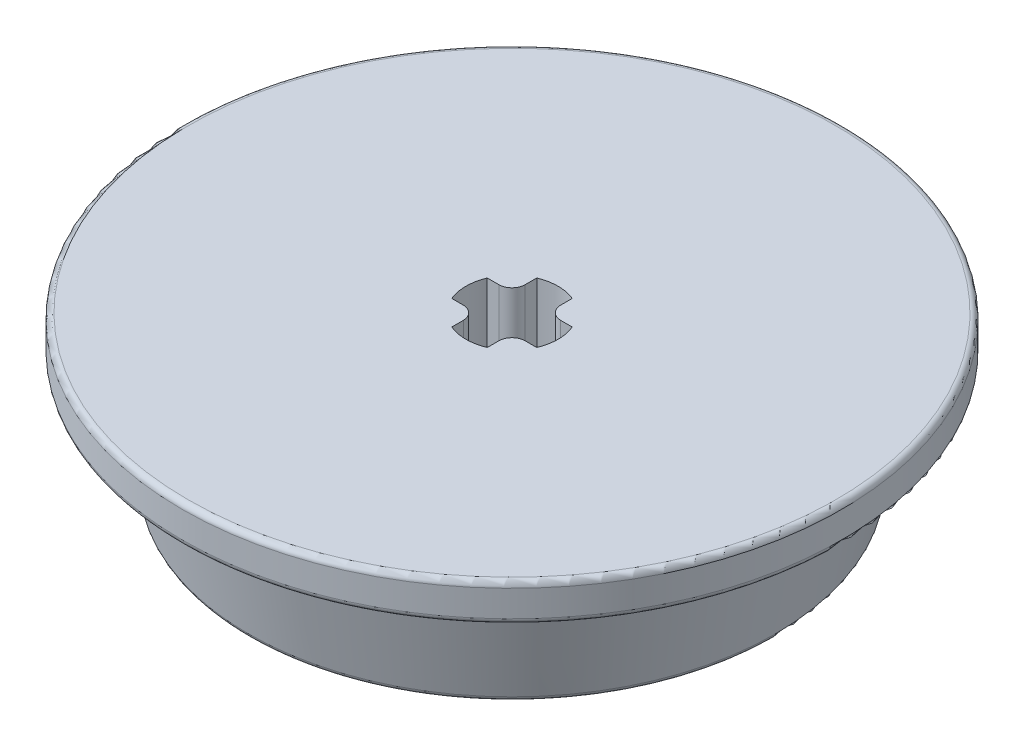
ISO-10303-21;
HEADER;
FILE_DESCRIPTION(('STEP AP214'),'2;1');
FILE_NAME('part.step','',(''),(''),'','','');
FILE_SCHEMA(('AUTOMOTIVE_DESIGN { 1 0 10303 214 1 1 1 1 }'));
ENDSEC;
DATA;
#1=APPLICATION_CONTEXT('core data for automotive mechanical design processes');
#2=APPLICATION_PROTOCOL_DEFINITION('international standard','automotive_design',2000,#1);
#3=PRODUCT_CONTEXT('',#1,'mechanical');
#4=PRODUCT('Part','Part','',(#3));
#5=PRODUCT_RELATED_PRODUCT_CATEGORY('part','',(#4));
#6=PRODUCT_DEFINITION_FORMATION('','',#4);
#7=PRODUCT_DEFINITION_CONTEXT('part definition',#1,'design');
#8=PRODUCT_DEFINITION('design','',#6,#7);
#9=PRODUCT_DEFINITION_SHAPE('','',#8);
#10=(LENGTH_UNIT() NAMED_UNIT(*) SI_UNIT(.MILLI.,.METRE.));
#11=(NAMED_UNIT(*) PLANE_ANGLE_UNIT() SI_UNIT($,.RADIAN.));
#12=(NAMED_UNIT(*) SI_UNIT($,.STERADIAN.) SOLID_ANGLE_UNIT());
#13=UNCERTAINTY_MEASURE_WITH_UNIT(LENGTH_MEASURE(1.E-05),#10,'distance_accuracy_value','');
#14=(GEOMETRIC_REPRESENTATION_CONTEXT(3) GLOBAL_UNCERTAINTY_ASSIGNED_CONTEXT((#13)) GLOBAL_UNIT_ASSIGNED_CONTEXT((#10,
#11,#12)) REPRESENTATION_CONTEXT('',''));
#15=CARTESIAN_POINT('',(0.,0.,0.));
#16=DIRECTION('',(0.,0.,1.));
#17=DIRECTION('',(1.,0.,0.));
#18=AXIS2_PLACEMENT_3D('',#15,#16,#17);
#19=CARTESIAN_POINT('',(0.,0.,0.));
#20=DIRECTION('',(0.,1.,0.));
#21=DIRECTION('',(0.,0.,1.));
#22=AXIS2_PLACEMENT_3D('',#19,#20,#21);
#23=PLANE('',#22);
#24=CARTESIAN_POINT('',(0.,0.,0.));
#25=DIRECTION('',(0.,1.,0.));
#26=DIRECTION('',(0.,0.,1.));
#27=AXIS2_PLACEMENT_3D('',#24,#25,#26);
#28=CIRCLE('',#27,17.1604709958205);
#29=CARTESIAN_POINT('',(0.,0.,17.1604709958205));
#30=VERTEX_POINT('',#29);
#31=EDGE_CURVE('E293',#30,#30,#28,.T.);
#32=ORIENTED_EDGE('',*,*,#31,.T.);
#33=EDGE_LOOP('',(#32));
#34=FACE_BOUND('',#33,.T.);
#35=DIRECTION('',(0.,0.,1.));
#36=VECTOR('',#35,1.);
#37=CARTESIAN_POINT('',(-0.940000000000001,0.,0.940000000000009));
#38=LINE('',#37,#36);
#39=CARTESIAN_POINT('',(-0.940000000000001,0.,1.64000000000001));
#40=VERTEX_POINT('',#39);
#41=CARTESIAN_POINT('',(-0.94,0.,2.25166604983954));
#42=VERTEX_POINT('',#41);
#43=EDGE_CURVE('E210',#40,#42,#38,.T.);
#44=ORIENTED_EDGE('',*,*,#43,.F.);
#45=CARTESIAN_POINT('',(-1.64,0.,1.64000000000001));
#46=DIRECTION('',(0.,1.,0.));
#47=DIRECTION('',(0.,0.,1.));
#48=AXIS2_PLACEMENT_3D('',#45,#46,#47);
#49=CIRCLE('',#48,0.7);
#50=CARTESIAN_POINT('',(-1.64,0.,0.940000000000009));
#51=VERTEX_POINT('',#50);
#52=EDGE_CURVE('E254',#40,#51,#49,.T.);
#53=ORIENTED_EDGE('',*,*,#52,.T.);
#54=DIRECTION('',(1.,0.,0.));
#55=VECTOR('',#54,1.);
#56=CARTESIAN_POINT('',(-2.25166604983954,0.,0.940000000000009));
#57=LINE('',#56,#55);
#58=CARTESIAN_POINT('',(-2.25166604983954,0.,0.940000000000008));
#59=VERTEX_POINT('',#58);
#60=EDGE_CURVE('E208',#59,#51,#57,.T.);
#61=ORIENTED_EDGE('',*,*,#60,.F.);
#62=CARTESIAN_POINT('',(0.,0.,0.));
#63=DIRECTION('',(0.,1.,0.));
#64=DIRECTION('',(0.,0.,1.));
#65=AXIS2_PLACEMENT_3D('',#62,#63,#64);
#66=CIRCLE('',#65,2.44);
#67=CARTESIAN_POINT('',(-2.25166604983954,0.,-0.940000000000009));
#68=VERTEX_POINT('',#67);
#69=EDGE_CURVE('E160',#68,#59,#66,.T.);
#70=ORIENTED_EDGE('',*,*,#69,.F.);
#71=DIRECTION('',(-1.,0.,0.));
#72=VECTOR('',#71,1.);
#73=CARTESIAN_POINT('',(-0.94,0.,-0.940000000000009));
#74=LINE('',#73,#72);
#75=CARTESIAN_POINT('',(-1.64,0.,-0.940000000000009));
#76=VERTEX_POINT('',#75);
#77=EDGE_CURVE('E205',#76,#68,#74,.T.);
#78=ORIENTED_EDGE('',*,*,#77,.F.);
#79=CARTESIAN_POINT('',(-1.64,0.,-1.64000000000001));
#80=DIRECTION('',(0.,1.,0.));
#81=DIRECTION('',(0.,0.,1.));
#82=AXIS2_PLACEMENT_3D('',#79,#80,#81);
#83=CIRCLE('',#82,0.7);
#84=CARTESIAN_POINT('',(-0.94,0.,-1.64000000000001));
#85=VERTEX_POINT('',#84);
#86=EDGE_CURVE('E248',#76,#85,#83,.T.);
#87=ORIENTED_EDGE('',*,*,#86,.T.);
#88=DIRECTION('',(0.,0.,1.));
#89=VECTOR('',#88,1.);
#90=CARTESIAN_POINT('',(-0.94,0.,-2.25166604983954));
#91=LINE('',#90,#89);
#92=CARTESIAN_POINT('',(-0.940000000000001,0.,-2.25166604983954));
#93=VERTEX_POINT('',#92);
#94=EDGE_CURVE('E202',#93,#85,#91,.T.);
#95=ORIENTED_EDGE('',*,*,#94,.F.);
#96=CARTESIAN_POINT('',(0.,0.,0.));
#97=DIRECTION('',(0.,1.,0.));
#98=DIRECTION('',(0.,0.,-1.));
#99=AXIS2_PLACEMENT_3D('',#96,#97,#98);
#100=CIRCLE('',#99,2.44);
#101=CARTESIAN_POINT('',(0.94,0.,-2.25166604983954));
#102=VERTEX_POINT('',#101);
#103=EDGE_CURVE('E227',#102,#93,#100,.T.);
#104=ORIENTED_EDGE('',*,*,#103,.F.);
#105=DIRECTION('',(0.,0.,-1.));
#106=VECTOR('',#105,1.);
#107=CARTESIAN_POINT('',(0.94,0.,-2.25166604983954));
#108=LINE('',#107,#106);
#109=CARTESIAN_POINT('',(0.94,0.,-1.64));
#110=VERTEX_POINT('',#109);
#111=EDGE_CURVE('E225',#110,#102,#108,.T.);
#112=ORIENTED_EDGE('',*,*,#111,.F.);
#113=CARTESIAN_POINT('',(1.64,0.,-1.64));
#114=DIRECTION('',(0.,1.,0.));
#115=DIRECTION('',(0.,0.,1.));
#116=AXIS2_PLACEMENT_3D('',#113,#114,#115);
#117=CIRCLE('',#116,0.7);
#118=CARTESIAN_POINT('',(1.64,0.,-0.940000000000003));
#119=VERTEX_POINT('',#118);
#120=EDGE_CURVE('E250',#110,#119,#117,.T.);
#121=ORIENTED_EDGE('',*,*,#120,.T.);
#122=DIRECTION('',(-1.,0.,0.));
#123=VECTOR('',#122,1.);
#124=CARTESIAN_POINT('',(0.94,0.,-0.940000000000003));
#125=LINE('',#124,#123);
#126=CARTESIAN_POINT('',(2.25166604983954,0.,-0.940000000000003));
#127=VERTEX_POINT('',#126);
#128=EDGE_CURVE('E223',#127,#119,#125,.T.);
#129=ORIENTED_EDGE('',*,*,#128,.F.);
#130=CARTESIAN_POINT('',(0.,0.,0.));
#131=DIRECTION('',(0.,1.,0.));
#132=DIRECTION('',(0.,0.,-1.));
#133=AXIS2_PLACEMENT_3D('',#130,#131,#132);
#134=CIRCLE('',#133,2.44);
#135=CARTESIAN_POINT('',(2.25166604983954,0.,0.940000000000003));
#136=VERTEX_POINT('',#135);
#137=EDGE_CURVE('E220',#136,#127,#134,.T.);
#138=ORIENTED_EDGE('',*,*,#137,.F.);
#139=DIRECTION('',(1.,0.,0.));
#140=VECTOR('',#139,1.);
#141=CARTESIAN_POINT('',(0.940000000000001,0.,0.940000000000003));
#142=LINE('',#141,#140);
#143=CARTESIAN_POINT('',(1.64,0.,0.940000000000003));
#144=VERTEX_POINT('',#143);
#145=EDGE_CURVE('E218',#144,#136,#142,.T.);
#146=ORIENTED_EDGE('',*,*,#145,.F.);
#147=CARTESIAN_POINT('',(1.64,0.,1.64));
#148=DIRECTION('',(0.,1.,0.));
#149=DIRECTION('',(0.,0.,1.));
#150=AXIS2_PLACEMENT_3D('',#147,#148,#149);
#151=CIRCLE('',#150,0.7);
#152=CARTESIAN_POINT('',(0.940000000000001,0.,1.64));
#153=VERTEX_POINT('',#152);
#154=EDGE_CURVE('E252',#144,#153,#151,.T.);
#155=ORIENTED_EDGE('',*,*,#154,.T.);
#156=DIRECTION('',(0.,0.,-1.));
#157=VECTOR('',#156,1.);
#158=CARTESIAN_POINT('',(0.940000000000001,0.,2.25166604983954));
#159=LINE('',#158,#157);
#160=CARTESIAN_POINT('',(0.94,0.,2.25166604983954));
#161=VERTEX_POINT('',#160);
#162=EDGE_CURVE('E215',#161,#153,#159,.T.);
#163=ORIENTED_EDGE('',*,*,#162,.F.);
#164=CARTESIAN_POINT('',(0.,0.,0.));
#165=DIRECTION('',(0.,1.,0.));
#166=DIRECTION('',(0.,0.,1.));
#167=AXIS2_PLACEMENT_3D('',#164,#165,#166);
#168=CIRCLE('',#167,2.44);
#169=EDGE_CURVE('E212',#42,#161,#168,.T.);
#170=ORIENTED_EDGE('',*,*,#169,.F.);
#171=EDGE_LOOP('',(#44,#53,#61,#70,#78,#87,#95,#104,#112,#121,#129,#138,#146,#155,#163,#170));
#172=FACE_BOUND('',#171,.T.);
#173=ADVANCED_FACE('F37',(#34,#172),#23,.T.);
#174=CARTESIAN_POINT('',(0.,0.,0.));
#175=DIRECTION('',(0.,-1.,0.));
#176=DIRECTION('',(0.,0.,-1.));
#177=AXIS2_PLACEMENT_3D('',#174,#175,#176);
#178=CYLINDRICAL_SURFACE('',#177,17.4604709958205);
#179=CARTESIAN_POINT('',(0.,-0.3,0.));
#180=DIRECTION('',(0.,1.,0.));
#181=DIRECTION('',(0.,0.,1.));
#182=AXIS2_PLACEMENT_3D('',#179,#180,#181);
#183=CIRCLE('',#182,17.4604709958205);
#184=CARTESIAN_POINT('',(0.,-0.3,17.4604709958205));
#185=VERTEX_POINT('',#184);
#186=EDGE_CURVE('E290',#185,#185,#183,.F.);
#187=ORIENTED_EDGE('',*,*,#186,.T.);
#188=EDGE_LOOP('',(#187));
#189=FACE_BOUND('',#188,.T.);
#190=CARTESIAN_POINT('',(0.,-1.7,0.));
#191=DIRECTION('',(0.,-1.,0.));
#192=DIRECTION('',(0.,0.,-1.));
#193=AXIS2_PLACEMENT_3D('',#190,#191,#192);
#194=CIRCLE('',#193,17.4604709958205);
#195=CARTESIAN_POINT('',(0.,-1.7,-17.4604709958205));
#196=VERTEX_POINT('',#195);
#197=EDGE_CURVE('E287',#196,#196,#194,.F.);
#198=ORIENTED_EDGE('',*,*,#197,.T.);
#199=EDGE_LOOP('',(#198));
#200=FACE_BOUND('',#199,.T.);
#201=ADVANCED_FACE('F310',(#189,#200),#178,.T.);
#202=CARTESIAN_POINT('',(17.4604709958205,-2.,0.));
#203=DIRECTION('',(0.,-1.,0.));
#204=DIRECTION('',(0.,0.,-1.));
#205=AXIS2_PLACEMENT_3D('',#202,#203,#204);
#206=PLANE('',#205);
#207=CARTESIAN_POINT('',(0.,-2.,0.));
#208=DIRECTION('',(0.,-1.,0.));
#209=DIRECTION('',(0.,0.,-1.));
#210=AXIS2_PLACEMENT_3D('',#207,#208,#209);
#211=CIRCLE('',#210,15.2506361989496);
#212=CARTESIAN_POINT('',(0.,-2.,-15.2506361989496));
#213=VERTEX_POINT('',#212);
#214=EDGE_CURVE('E11',#213,#213,#211,.F.);
#215=ORIENTED_EDGE('',*,*,#214,.T.);
#216=EDGE_LOOP('',(#215));
#217=FACE_BOUND('',#216,.T.);
#218=CARTESIAN_POINT('',(0.,-2.,0.));
#219=DIRECTION('',(0.,-1.,0.));
#220=DIRECTION('',(0.,0.,-1.));
#221=AXIS2_PLACEMENT_3D('',#218,#219,#220);
#222=CIRCLE('',#221,17.1604709958205);
#223=CARTESIAN_POINT('',(0.,-2.,-17.1604709958205));
#224=VERTEX_POINT('',#223);
#225=EDGE_CURVE('E45',#224,#224,#222,.T.);
#226=ORIENTED_EDGE('',*,*,#225,.T.);
#227=EDGE_LOOP('',(#226));
#228=FACE_BOUND('',#227,.T.);
#229=ADVANCED_FACE('F298',(#217,#228),#206,.T.);
#230=CARTESIAN_POINT('',(0.,-8.,0.));
#231=DIRECTION('',(0.,1.,0.));
#232=DIRECTION('',(0.,0.,1.));
#233=AXIS2_PLACEMENT_3D('',#230,#231,#232);
#234=CONICAL_SURFACE('',#233,13.9155,0.178819305732636);
#235=CARTESIAN_POINT('',(0.,-7.75336034909016,0.));
#236=DIRECTION('',(0.,-1.,0.));
#237=DIRECTION('',(0.,0.,-1.));
#238=AXIS2_PLACEMENT_3D('',#235,#236,#237);
#239=CIRCLE('',#238,13.960080116902);
#240=CARTESIAN_POINT('',(0.,-7.75336034909016,-13.960080116902));
#241=VERTEX_POINT('',#240);
#242=EDGE_CURVE('E284',#241,#241,#239,.F.);
#243=ORIENTED_EDGE('',*,*,#242,.T.);
#244=EDGE_LOOP('',(#243));
#245=FACE_BOUND('',#244,.T.);
#246=CARTESIAN_POINT('',(0.,-2.24663965090983,0.));
#247=DIRECTION('',(0.,1.,0.));
#248=DIRECTION('',(0.,0.,1.));
#249=AXIS2_PLACEMENT_3D('',#246,#247,#248);
#250=CIRCLE('',#249,14.955419883098);
#251=CARTESIAN_POINT('',(0.,-2.24663965090983,14.955419883098));
#252=VERTEX_POINT('',#251);
#253=EDGE_CURVE('E281',#252,#252,#250,.F.);
#254=ORIENTED_EDGE('',*,*,#253,.T.);
#255=EDGE_LOOP('',(#254));
#256=FACE_BOUND('',#255,.T.);
#257=ADVANCED_FACE('F520',(#245,#256),#234,.T.);
#258=CARTESIAN_POINT('',(13.9155,-8.,0.));
#259=DIRECTION('',(0.,-1.,0.));
#260=DIRECTION('',(0.,0.,-1.));
#261=AXIS2_PLACEMENT_3D('',#258,#259,#260);
#262=PLANE('',#261);
#263=CARTESIAN_POINT('',(0.,-8.,0.));
#264=DIRECTION('',(0.,-1.,0.));
#265=DIRECTION('',(0.,0.,-1.));
#266=AXIS2_PLACEMENT_3D('',#263,#264,#265);
#267=CIRCLE('',#266,13.6648638010504);
#268=CARTESIAN_POINT('',(0.,-8.,-13.6648638010504));
#269=VERTEX_POINT('',#268);
#270=EDGE_CURVE('E278',#269,#269,#267,.T.);
#271=ORIENTED_EDGE('',*,*,#270,.T.);
#272=EDGE_LOOP('',(#271));
#273=FACE_BOUND('',#272,.T.);
#274=DIRECTION('',(1.,0.,0.));
#275=VECTOR('',#274,1.);
#276=CARTESIAN_POINT('',(-2.25166604983954,-8.,0.940000000000009));
#277=LINE('',#276,#275);
#278=CARTESIAN_POINT('',(-2.25166604983954,-8.,0.940000000000008));
#279=VERTEX_POINT('',#278);
#280=CARTESIAN_POINT('',(-1.64,-8.,0.940000000000009));
#281=VERTEX_POINT('',#280);
#282=EDGE_CURVE('E168',#279,#281,#277,.T.);
#283=ORIENTED_EDGE('',*,*,#282,.T.);
#284=CARTESIAN_POINT('',(-1.64,-8.,1.64000000000001));
#285=DIRECTION('',(0.,-1.,0.));
#286=DIRECTION('',(0.,0.,-1.));
#287=AXIS2_PLACEMENT_3D('',#284,#285,#286);
#288=CIRCLE('',#287,0.7);
#289=CARTESIAN_POINT('',(-0.940000000000001,-8.,1.64000000000001));
#290=VERTEX_POINT('',#289);
#291=EDGE_CURVE('E262',#281,#290,#288,.T.);
#292=ORIENTED_EDGE('',*,*,#291,.T.);
#293=DIRECTION('',(0.,0.,1.));
#294=VECTOR('',#293,1.);
#295=CARTESIAN_POINT('',(-0.940000000000001,-8.,0.940000000000009));
#296=LINE('',#295,#294);
#297=CARTESIAN_POINT('',(-0.94,-8.,2.25166604983954));
#298=VERTEX_POINT('',#297);
#299=EDGE_CURVE('E173',#290,#298,#296,.T.);
#300=ORIENTED_EDGE('',*,*,#299,.T.);
#301=CARTESIAN_POINT('',(0.,-8.,0.));
#302=DIRECTION('',(0.,1.,0.));
#303=DIRECTION('',(0.,0.,1.));
#304=AXIS2_PLACEMENT_3D('',#301,#302,#303);
#305=CIRCLE('',#304,2.44);
#306=CARTESIAN_POINT('',(0.94,-8.,2.25166604983954));
#307=VERTEX_POINT('',#306);
#308=EDGE_CURVE('E184',#298,#307,#305,.T.);
#309=ORIENTED_EDGE('',*,*,#308,.T.);
#310=DIRECTION('',(0.,0.,-1.));
#311=VECTOR('',#310,1.);
#312=CARTESIAN_POINT('',(0.940000000000001,-8.,2.25166604983954));
#313=LINE('',#312,#311);
#314=CARTESIAN_POINT('',(0.940000000000001,-8.,1.64));
#315=VERTEX_POINT('',#314);
#316=EDGE_CURVE('E187',#307,#315,#313,.T.);
#317=ORIENTED_EDGE('',*,*,#316,.T.);
#318=CARTESIAN_POINT('',(1.64,-8.,1.64));
#319=DIRECTION('',(0.,-1.,0.));
#320=DIRECTION('',(0.,0.,-1.));
#321=AXIS2_PLACEMENT_3D('',#318,#319,#320);
#322=CIRCLE('',#321,0.7);
#323=CARTESIAN_POINT('',(1.64,-8.,0.940000000000003));
#324=VERTEX_POINT('',#323);
#325=EDGE_CURVE('E260',#315,#324,#322,.T.);
#326=ORIENTED_EDGE('',*,*,#325,.T.);
#327=DIRECTION('',(1.,0.,0.));
#328=VECTOR('',#327,1.);
#329=CARTESIAN_POINT('',(0.940000000000001,-8.,0.940000000000003));
#330=LINE('',#329,#328);
#331=CARTESIAN_POINT('',(2.25166604983954,-8.,0.940000000000003));
#332=VERTEX_POINT('',#331);
#333=EDGE_CURVE('E190',#324,#332,#330,.T.);
#334=ORIENTED_EDGE('',*,*,#333,.T.);
#335=CARTESIAN_POINT('',(0.,-8.,0.));
#336=DIRECTION('',(0.,1.,0.));
#337=DIRECTION('',(0.,0.,-1.));
#338=AXIS2_PLACEMENT_3D('',#335,#336,#337);
#339=CIRCLE('',#338,2.44);
#340=CARTESIAN_POINT('',(2.25166604983954,-8.,-0.940000000000003));
#341=VERTEX_POINT('',#340);
#342=EDGE_CURVE('E192',#332,#341,#339,.T.);
#343=ORIENTED_EDGE('',*,*,#342,.T.);
#344=DIRECTION('',(-1.,0.,0.));
#345=VECTOR('',#344,1.);
#346=CARTESIAN_POINT('',(0.94,-8.,-0.940000000000003));
#347=LINE('',#346,#345);
#348=CARTESIAN_POINT('',(1.64,-8.,-0.940000000000003));
#349=VERTEX_POINT('',#348);
#350=EDGE_CURVE('E195',#341,#349,#347,.T.);
#351=ORIENTED_EDGE('',*,*,#350,.T.);
#352=CARTESIAN_POINT('',(1.64,-8.,-1.64));
#353=DIRECTION('',(0.,-1.,0.));
#354=DIRECTION('',(0.,0.,-1.));
#355=AXIS2_PLACEMENT_3D('',#352,#353,#354);
#356=CIRCLE('',#355,0.7);
#357=CARTESIAN_POINT('',(0.94,-8.,-1.64));
#358=VERTEX_POINT('',#357);
#359=EDGE_CURVE('E52',#349,#358,#356,.T.);
#360=ORIENTED_EDGE('',*,*,#359,.T.);
#361=DIRECTION('',(0.,0.,-1.));
#362=VECTOR('',#361,1.);
#363=CARTESIAN_POINT('',(0.94,-8.,-2.25166604983954));
#364=LINE('',#363,#362);
#365=CARTESIAN_POINT('',(0.94,-8.,-2.25166604983954));
#366=VERTEX_POINT('',#365);
#367=EDGE_CURVE('E197',#358,#366,#364,.T.);
#368=ORIENTED_EDGE('',*,*,#367,.T.);
#369=CARTESIAN_POINT('',(0.,-8.,0.));
#370=DIRECTION('',(0.,1.,0.));
#371=DIRECTION('',(0.,0.,-1.));
#372=AXIS2_PLACEMENT_3D('',#369,#370,#371);
#373=CIRCLE('',#372,2.44);
#374=CARTESIAN_POINT('',(-0.940000000000001,-8.,-2.25166604983954));
#375=VERTEX_POINT('',#374);
#376=EDGE_CURVE('E199',#366,#375,#373,.T.);
#377=ORIENTED_EDGE('',*,*,#376,.T.);
#378=DIRECTION('',(0.,0.,1.));
#379=VECTOR('',#378,1.);
#380=CARTESIAN_POINT('',(-0.94,-8.,-2.25166604983954));
#381=LINE('',#380,#379);
#382=CARTESIAN_POINT('',(-0.94,-8.,-1.64000000000001));
#383=VERTEX_POINT('',#382);
#384=EDGE_CURVE('E179',#375,#383,#381,.T.);
#385=ORIENTED_EDGE('',*,*,#384,.T.);
#386=CARTESIAN_POINT('',(-1.64,-8.,-1.64000000000001));
#387=DIRECTION('',(0.,-1.,0.));
#388=DIRECTION('',(0.,0.,-1.));
#389=AXIS2_PLACEMENT_3D('',#386,#387,#388);
#390=CIRCLE('',#389,0.7);
#391=CARTESIAN_POINT('',(-1.64,-8.,-0.940000000000009));
#392=VERTEX_POINT('',#391);
#393=EDGE_CURVE('E257',#383,#392,#390,.T.);
#394=ORIENTED_EDGE('',*,*,#393,.T.);
#395=DIRECTION('',(-1.,0.,0.));
#396=VECTOR('',#395,1.);
#397=CARTESIAN_POINT('',(-0.94,-8.,-0.940000000000009));
#398=LINE('',#397,#396);
#399=CARTESIAN_POINT('',(-2.25166604983954,-8.,-0.940000000000009));
#400=VERTEX_POINT('',#399);
#401=EDGE_CURVE('E177',#392,#400,#398,.T.);
#402=ORIENTED_EDGE('',*,*,#401,.T.);
#403=CARTESIAN_POINT('',(0.,-8.,0.));
#404=DIRECTION('',(0.,1.,0.));
#405=DIRECTION('',(0.,0.,1.));
#406=AXIS2_PLACEMENT_3D('',#403,#404,#405);
#407=CIRCLE('',#406,2.44);
#408=EDGE_CURVE('E157',#400,#279,#407,.T.);
#409=ORIENTED_EDGE('',*,*,#408,.T.);
#410=EDGE_LOOP('',(#283,#292,#300,#309,#317,#326,#334,#343,#351,#360,#368,#377,#385,#394,#402,#409));
#411=FACE_BOUND('',#410,.T.);
#412=ADVANCED_FACE('F175',(#273,#411),#262,.T.);
#413=CARTESIAN_POINT('',(-0.94,-8.,-2.25166604983954));
#414=DIRECTION('',(-1.,0.,0.));
#415=DIRECTION('',(0.,0.,1.));
#416=AXIS2_PLACEMENT_3D('',#413,#414,#415);
#417=PLANE('',#416);
#418=ORIENTED_EDGE('',*,*,#94,.T.);
#419=DIRECTION('',(0.,1.,0.));
#420=VECTOR('',#419,1.);
#421=CARTESIAN_POINT('',(-0.94,-8.,-1.64000000000001));
#422=LINE('',#421,#420);
#423=EDGE_CURVE('E276',#85,#383,#422,.F.);
#424=ORIENTED_EDGE('',*,*,#423,.T.);
#425=ORIENTED_EDGE('',*,*,#384,.F.);
#426=DIRECTION('',(0.,1.,0.));
#427=VECTOR('',#426,1.);
#428=CARTESIAN_POINT('',(-0.940000000000001,-8.,-2.25166604983954));
#429=LINE('',#428,#427);
#430=EDGE_CURVE('E230',#375,#93,#429,.T.);
#431=ORIENTED_EDGE('',*,*,#430,.T.);
#432=EDGE_LOOP('',(#418,#424,#425,#431));
#433=FACE_BOUND('',#432,.T.);
#434=ADVANCED_FACE('F501',(#433),#417,.F.);
#435=CARTESIAN_POINT('',(0.,-8.,0.));
#436=DIRECTION('',(0.,1.,0.));
#437=DIRECTION('',(0.,0.,1.));
#438=AXIS2_PLACEMENT_3D('',#435,#436,#437);
#439=CYLINDRICAL_SURFACE('',#438,2.44);
#440=ORIENTED_EDGE('',*,*,#103,.T.);
#441=ORIENTED_EDGE('',*,*,#430,.F.);
#442=ORIENTED_EDGE('',*,*,#376,.F.);
#443=DIRECTION('',(0.,1.,0.));
#444=VECTOR('',#443,1.);
#445=CARTESIAN_POINT('',(0.94,-8.,-2.25166604983954));
#446=LINE('',#445,#444);
#447=EDGE_CURVE('E233',#366,#102,#446,.T.);
#448=ORIENTED_EDGE('',*,*,#447,.T.);
#449=EDGE_LOOP('',(#440,#441,#442,#448));
#450=FACE_BOUND('',#449,.T.);
#451=ADVANCED_FACE('F491',(#450),#439,.F.);
#452=CARTESIAN_POINT('',(0.94,-8.,-2.25166604983954));
#453=DIRECTION('',(1.,0.,0.));
#454=DIRECTION('',(0.,0.,-1.));
#455=AXIS2_PLACEMENT_3D('',#452,#453,#454);
#456=PLANE('',#455);
#457=ORIENTED_EDGE('',*,*,#367,.F.);
#458=DIRECTION('',(0.,1.,0.));
#459=VECTOR('',#458,1.);
#460=CARTESIAN_POINT('',(0.94,-8.,-1.64));
#461=LINE('',#460,#459);
#462=EDGE_CURVE('E269',#358,#110,#461,.T.);
#463=ORIENTED_EDGE('',*,*,#462,.T.);
#464=ORIENTED_EDGE('',*,*,#111,.T.);
#465=ORIENTED_EDGE('',*,*,#447,.F.);
#466=EDGE_LOOP('',(#457,#463,#464,#465));
#467=FACE_BOUND('',#466,.T.);
#468=ADVANCED_FACE('F482',(#467),#456,.F.);
#469=CARTESIAN_POINT('',(0.94,-8.,-0.940000000000003));
#470=DIRECTION('',(0.,0.,-1.));
#471=DIRECTION('',(-1.,0.,0.));
#472=AXIS2_PLACEMENT_3D('',#469,#470,#471);
#473=PLANE('',#472);
#474=ORIENTED_EDGE('',*,*,#128,.T.);
#475=DIRECTION('',(0.,1.,0.));
#476=VECTOR('',#475,1.);
#477=CARTESIAN_POINT('',(1.64,-8.,-0.940000000000003));
#478=LINE('',#477,#476);
#479=EDGE_CURVE('E60',#119,#349,#478,.F.);
#480=ORIENTED_EDGE('',*,*,#479,.T.);
#481=ORIENTED_EDGE('',*,*,#350,.F.);
#482=DIRECTION('',(0.,1.,0.));
#483=VECTOR('',#482,1.);
#484=CARTESIAN_POINT('',(2.25166604983954,-8.,-0.940000000000003));
#485=LINE('',#484,#483);
#486=EDGE_CURVE('E236',#341,#127,#485,.T.);
#487=ORIENTED_EDGE('',*,*,#486,.T.);
#488=EDGE_LOOP('',(#474,#480,#481,#487));
#489=FACE_BOUND('',#488,.T.);
#490=ADVANCED_FACE('F472',(#489),#473,.F.);
#491=CARTESIAN_POINT('',(0.,-8.,0.));
#492=DIRECTION('',(0.,1.,0.));
#493=DIRECTION('',(0.,0.,1.));
#494=AXIS2_PLACEMENT_3D('',#491,#492,#493);
#495=CYLINDRICAL_SURFACE('',#494,2.44);
#496=ORIENTED_EDGE('',*,*,#137,.T.);
#497=ORIENTED_EDGE('',*,*,#486,.F.);
#498=ORIENTED_EDGE('',*,*,#342,.F.);
#499=DIRECTION('',(0.,1.,0.));
#500=VECTOR('',#499,1.);
#501=CARTESIAN_POINT('',(2.25166604983954,-8.,0.940000000000003));
#502=LINE('',#501,#500);
#503=EDGE_CURVE('E238',#332,#136,#502,.T.);
#504=ORIENTED_EDGE('',*,*,#503,.T.);
#505=EDGE_LOOP('',(#496,#497,#498,#504));
#506=FACE_BOUND('',#505,.T.);
#507=ADVANCED_FACE('F462',(#506),#495,.F.);
#508=CARTESIAN_POINT('',(0.940000000000001,-8.,0.940000000000003));
#509=DIRECTION('',(0.,0.,1.));
#510=DIRECTION('',(1.,0.,0.));
#511=AXIS2_PLACEMENT_3D('',#508,#509,#510);
#512=PLANE('',#511);
#513=ORIENTED_EDGE('',*,*,#333,.F.);
#514=DIRECTION('',(0.,1.,0.));
#515=VECTOR('',#514,1.);
#516=CARTESIAN_POINT('',(1.64,-8.,0.940000000000003));
#517=LINE('',#516,#515);
#518=EDGE_CURVE('E264',#324,#144,#517,.T.);
#519=ORIENTED_EDGE('',*,*,#518,.T.);
#520=ORIENTED_EDGE('',*,*,#145,.T.);
#521=ORIENTED_EDGE('',*,*,#503,.F.);
#522=EDGE_LOOP('',(#513,#519,#520,#521));
#523=FACE_BOUND('',#522,.T.);
#524=ADVANCED_FACE('F452',(#523),#512,.F.);
#525=CARTESIAN_POINT('',(0.940000000000001,-8.,2.25166604983954));
#526=DIRECTION('',(1.,0.,0.));
#527=DIRECTION('',(0.,0.,-1.));
#528=AXIS2_PLACEMENT_3D('',#525,#526,#527);
#529=PLANE('',#528);
#530=ORIENTED_EDGE('',*,*,#162,.T.);
#531=DIRECTION('',(0.,1.,0.));
#532=VECTOR('',#531,1.);
#533=CARTESIAN_POINT('',(0.940000000000001,-8.,1.64));
#534=LINE('',#533,#532);
#535=EDGE_CURVE('E267',#153,#315,#534,.F.);
#536=ORIENTED_EDGE('',*,*,#535,.T.);
#537=ORIENTED_EDGE('',*,*,#316,.F.);
#538=DIRECTION('',(0.,1.,0.));
#539=VECTOR('',#538,1.);
#540=CARTESIAN_POINT('',(0.94,-8.,2.25166604983954));
#541=LINE('',#540,#539);
#542=EDGE_CURVE('E241',#307,#161,#541,.T.);
#543=ORIENTED_EDGE('',*,*,#542,.T.);
#544=EDGE_LOOP('',(#530,#536,#537,#543));
#545=FACE_BOUND('',#544,.T.);
#546=ADVANCED_FACE('F442',(#545),#529,.F.);
#547=CARTESIAN_POINT('',(0.,-8.,0.));
#548=DIRECTION('',(0.,1.,0.));
#549=DIRECTION('',(0.,0.,1.));
#550=AXIS2_PLACEMENT_3D('',#547,#548,#549);
#551=CYLINDRICAL_SURFACE('',#550,2.44);
#552=ORIENTED_EDGE('',*,*,#169,.T.);
#553=ORIENTED_EDGE('',*,*,#542,.F.);
#554=ORIENTED_EDGE('',*,*,#308,.F.);
#555=DIRECTION('',(0.,1.,0.));
#556=VECTOR('',#555,1.);
#557=CARTESIAN_POINT('',(-0.94,-8.,2.25166604983954));
#558=LINE('',#557,#556);
#559=EDGE_CURVE('E164',#298,#42,#558,.T.);
#560=ORIENTED_EDGE('',*,*,#559,.T.);
#561=EDGE_LOOP('',(#552,#553,#554,#560));
#562=FACE_BOUND('',#561,.T.);
#563=ADVANCED_FACE('F432',(#562),#551,.F.);
#564=CARTESIAN_POINT('',(-0.940000000000001,-8.,0.940000000000009));
#565=DIRECTION('',(-1.,0.,0.));
#566=DIRECTION('',(0.,0.,1.));
#567=AXIS2_PLACEMENT_3D('',#564,#565,#566);
#568=PLANE('',#567);
#569=ORIENTED_EDGE('',*,*,#299,.F.);
#570=DIRECTION('',(0.,1.,0.));
#571=VECTOR('',#570,1.);
#572=CARTESIAN_POINT('',(-0.940000000000001,-8.,1.64000000000001));
#573=LINE('',#572,#571);
#574=EDGE_CURVE('E232',#290,#40,#573,.T.);
#575=ORIENTED_EDGE('',*,*,#574,.T.);
#576=ORIENTED_EDGE('',*,*,#43,.T.);
#577=ORIENTED_EDGE('',*,*,#559,.F.);
#578=EDGE_LOOP('',(#569,#575,#576,#577));
#579=FACE_BOUND('',#578,.T.);
#580=ADVANCED_FACE('F423',(#579),#568,.F.);
#581=CARTESIAN_POINT('',(-2.25166604983954,-8.,0.940000000000009));
#582=DIRECTION('',(0.,0.,1.));
#583=DIRECTION('',(1.,0.,0.));
#584=AXIS2_PLACEMENT_3D('',#581,#582,#583);
#585=PLANE('',#584);
#586=ORIENTED_EDGE('',*,*,#60,.T.);
#587=DIRECTION('',(0.,1.,0.));
#588=VECTOR('',#587,1.);
#589=CARTESIAN_POINT('',(-1.64,-8.,0.940000000000009));
#590=LINE('',#589,#588);
#591=EDGE_CURVE('E171',#51,#281,#590,.F.);
#592=ORIENTED_EDGE('',*,*,#591,.T.);
#593=ORIENTED_EDGE('',*,*,#282,.F.);
#594=DIRECTION('',(0.,1.,0.));
#595=VECTOR('',#594,1.);
#596=CARTESIAN_POINT('',(-2.25166604983954,-8.,0.940000000000008));
#597=LINE('',#596,#595);
#598=EDGE_CURVE('E152',#279,#59,#597,.T.);
#599=ORIENTED_EDGE('',*,*,#598,.T.);
#600=EDGE_LOOP('',(#586,#592,#593,#599));
#601=FACE_BOUND('',#600,.T.);
#602=ADVANCED_FACE('F169',(#601),#585,.F.);
#603=CARTESIAN_POINT('',(0.,-8.,0.));
#604=DIRECTION('',(0.,1.,0.));
#605=DIRECTION('',(0.,0.,1.));
#606=AXIS2_PLACEMENT_3D('',#603,#604,#605);
#607=CYLINDRICAL_SURFACE('',#606,2.44);
#608=ORIENTED_EDGE('',*,*,#69,.T.);
#609=ORIENTED_EDGE('',*,*,#598,.F.);
#610=ORIENTED_EDGE('',*,*,#408,.F.);
#611=DIRECTION('',(0.,1.,0.));
#612=VECTOR('',#611,1.);
#613=CARTESIAN_POINT('',(-2.25166604983954,-8.,-0.940000000000009));
#614=LINE('',#613,#612);
#615=EDGE_CURVE('E165',#400,#68,#614,.T.);
#616=ORIENTED_EDGE('',*,*,#615,.T.);
#617=EDGE_LOOP('',(#608,#609,#610,#616));
#618=FACE_BOUND('',#617,.T.);
#619=ADVANCED_FACE('F154',(#618),#607,.F.);
#620=CARTESIAN_POINT('',(-0.94,-8.,-0.940000000000009));
#621=DIRECTION('',(0.,0.,-1.));
#622=DIRECTION('',(-1.,0.,0.));
#623=AXIS2_PLACEMENT_3D('',#620,#621,#622);
#624=PLANE('',#623);
#625=ORIENTED_EDGE('',*,*,#401,.F.);
#626=DIRECTION('',(0.,1.,0.));
#627=VECTOR('',#626,1.);
#628=CARTESIAN_POINT('',(-1.64,-8.,-0.940000000000009));
#629=LINE('',#628,#627);
#630=EDGE_CURVE('E273',#392,#76,#629,.T.);
#631=ORIENTED_EDGE('',*,*,#630,.T.);
#632=ORIENTED_EDGE('',*,*,#77,.T.);
#633=ORIENTED_EDGE('',*,*,#615,.F.);
#634=EDGE_LOOP('',(#625,#631,#632,#633));
#635=FACE_BOUND('',#634,.T.);
#636=ADVANCED_FACE('F325',(#635),#624,.F.);
#637=CARTESIAN_POINT('',(-1.64,-8.,1.64000000000001));
#638=DIRECTION('',(0.,1.,0.));
#639=DIRECTION('',(0.,0.,1.));
#640=AXIS2_PLACEMENT_3D('',#637,#638,#639);
#641=CYLINDRICAL_SURFACE('',#640,0.7);
#642=ORIENTED_EDGE('',*,*,#291,.F.);
#643=ORIENTED_EDGE('',*,*,#591,.F.);
#644=ORIENTED_EDGE('',*,*,#52,.F.);
#645=ORIENTED_EDGE('',*,*,#574,.F.);
#646=EDGE_LOOP('',(#642,#643,#644,#645));
#647=FACE_BOUND('',#646,.T.);
#648=ADVANCED_FACE('F321',(#647),#641,.T.);
#649=CARTESIAN_POINT('',(1.64,-8.,1.64));
#650=DIRECTION('',(0.,1.,0.));
#651=DIRECTION('',(0.,0.,1.));
#652=AXIS2_PLACEMENT_3D('',#649,#650,#651);
#653=CYLINDRICAL_SURFACE('',#652,0.7);
#654=ORIENTED_EDGE('',*,*,#325,.F.);
#655=ORIENTED_EDGE('',*,*,#535,.F.);
#656=ORIENTED_EDGE('',*,*,#154,.F.);
#657=ORIENTED_EDGE('',*,*,#518,.F.);
#658=EDGE_LOOP('',(#654,#655,#656,#657));
#659=FACE_BOUND('',#658,.T.);
#660=ADVANCED_FACE('F324',(#659),#653,.T.);
#661=CARTESIAN_POINT('',(1.64,-8.,-1.64));
#662=DIRECTION('',(0.,1.,0.));
#663=DIRECTION('',(0.,0.,1.));
#664=AXIS2_PLACEMENT_3D('',#661,#662,#663);
#665=CYLINDRICAL_SURFACE('',#664,0.7);
#666=ORIENTED_EDGE('',*,*,#359,.F.);
#667=ORIENTED_EDGE('',*,*,#479,.F.);
#668=ORIENTED_EDGE('',*,*,#120,.F.);
#669=ORIENTED_EDGE('',*,*,#462,.F.);
#670=EDGE_LOOP('',(#666,#667,#668,#669));
#671=FACE_BOUND('',#670,.T.);
#672=ADVANCED_FACE('F329',(#671),#665,.T.);
#673=CARTESIAN_POINT('',(-1.64,-8.,-1.64000000000001));
#674=DIRECTION('',(0.,1.,0.));
#675=DIRECTION('',(0.,0.,1.));
#676=AXIS2_PLACEMENT_3D('',#673,#674,#675);
#677=CYLINDRICAL_SURFACE('',#676,0.7);
#678=ORIENTED_EDGE('',*,*,#393,.F.);
#679=ORIENTED_EDGE('',*,*,#423,.F.);
#680=ORIENTED_EDGE('',*,*,#86,.F.);
#681=ORIENTED_EDGE('',*,*,#630,.F.);
#682=EDGE_LOOP('',(#678,#679,#680,#681));
#683=FACE_BOUND('',#682,.T.);
#684=ADVANCED_FACE('F333',(#683),#677,.T.);
#685=CARTESIAN_POINT('',(0.,-7.7,0.));
#686=DIRECTION('',(0.,-1.,0.));
#687=DIRECTION('',(0.,0.,-1.));
#688=AXIS2_PLACEMENT_3D('',#685,#686,#687);
#689=TOROIDAL_SURFACE('',#688,13.6648638010504,0.3);
#690=ORIENTED_EDGE('',*,*,#242,.F.);
#691=EDGE_LOOP('',(#690));
#692=FACE_BOUND('',#691,.T.);
#693=ORIENTED_EDGE('',*,*,#270,.F.);
#694=EDGE_LOOP('',(#693));
#695=FACE_BOUND('',#694,.T.);
#696=ADVANCED_FACE('F337',(#692,#695),#689,.T.);
#697=CARTESIAN_POINT('',(0.,-0.3,0.));
#698=DIRECTION('',(0.,1.,0.));
#699=DIRECTION('',(0.,0.,1.));
#700=AXIS2_PLACEMENT_3D('',#697,#698,#699);
#701=TOROIDAL_SURFACE('',#700,17.1604709958205,0.3);
#702=ORIENTED_EDGE('',*,*,#31,.F.);
#703=EDGE_LOOP('',(#702));
#704=FACE_BOUND('',#703,.T.);
#705=ORIENTED_EDGE('',*,*,#186,.F.);
#706=EDGE_LOOP('',(#705));
#707=FACE_BOUND('',#706,.T.);
#708=ADVANCED_FACE('F306',(#704,#707),#701,.T.);
#709=CARTESIAN_POINT('',(0.,-2.3,0.));
#710=DIRECTION('',(0.,-1.,0.));
#711=DIRECTION('',(0.,0.,-1.));
#712=AXIS2_PLACEMENT_3D('',#709,#710,#711);
#713=TOROIDAL_SURFACE('',#712,15.2506361989496,0.3);
#714=ORIENTED_EDGE('',*,*,#214,.F.);
#715=EDGE_LOOP('',(#714));
#716=FACE_BOUND('',#715,.T.);
#717=ORIENTED_EDGE('',*,*,#253,.F.);
#718=EDGE_LOOP('',(#717));
#719=FACE_BOUND('',#718,.T.);
#720=ADVANCED_FACE('F301',(#716,#719),#713,.F.);
#721=CARTESIAN_POINT('',(0.,-1.7,0.));
#722=DIRECTION('',(0.,-1.,0.));
#723=DIRECTION('',(0.,0.,-1.));
#724=AXIS2_PLACEMENT_3D('',#721,#722,#723);
#725=TOROIDAL_SURFACE('',#724,17.1604709958205,0.3);
#726=ORIENTED_EDGE('',*,*,#197,.F.);
#727=EDGE_LOOP('',(#726));
#728=FACE_BOUND('',#727,.T.);
#729=ORIENTED_EDGE('',*,*,#225,.F.);
#730=EDGE_LOOP('',(#729));
#731=FACE_BOUND('',#730,.T.);
#732=ADVANCED_FACE('F39',(#728,#731),#725,.T.);
#733=CLOSED_SHELL('',(#173,#201,#229,#257,#412,#434,#451,#468,#490,#507,#524,#546,#563,#580,
#602,#619,#636,#648,#660,#672,#684,#696,#708,#720,#732));
#734=MANIFOLD_SOLID_BREP('B2',#733);
#735=ADVANCED_BREP_SHAPE_REPRESENTATION('',(#18,#734),#14);
#736=SHAPE_DEFINITION_REPRESENTATION(#9,#735);
ENDSEC;
END-ISO-10303-21;
